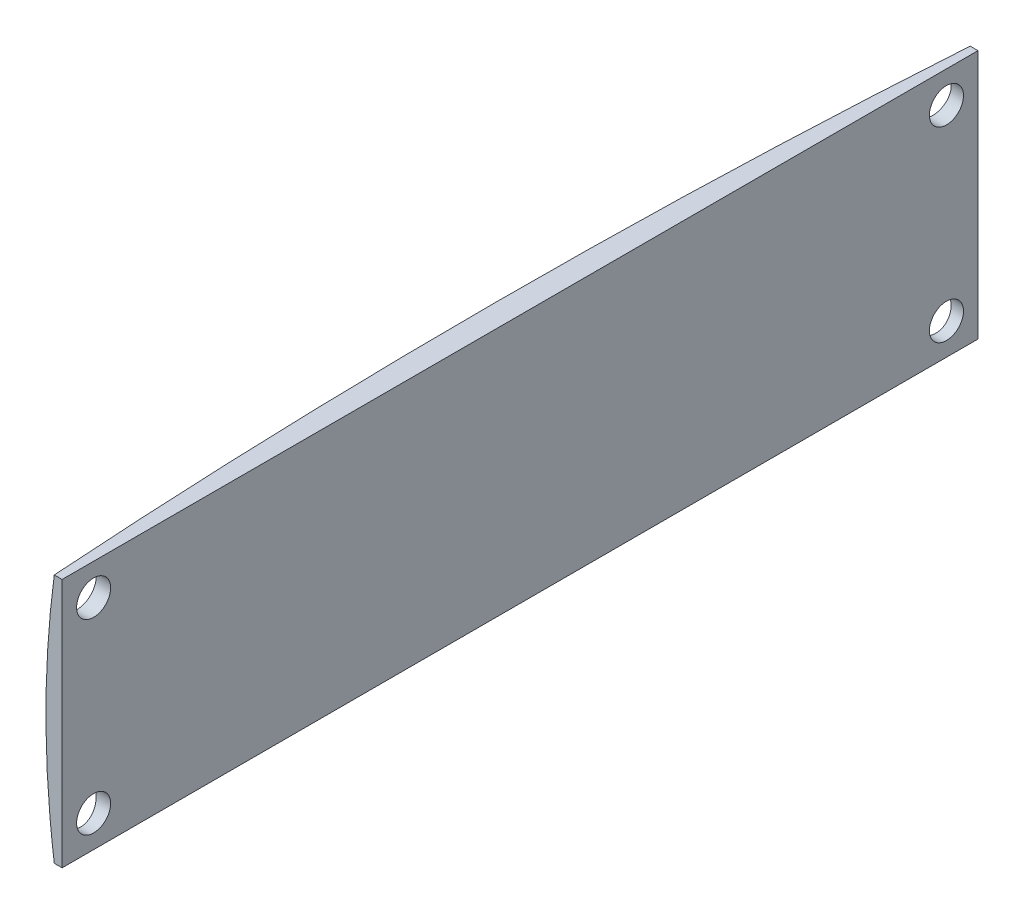
ISO-10303-21;
HEADER;
FILE_DESCRIPTION(('STEP AP214'),'2;1');
FILE_NAME('part.step','',(''),(''),'','','');
FILE_SCHEMA(('AUTOMOTIVE_DESIGN { 1 0 10303 214 1 1 1 1 }'));
ENDSEC;
DATA;
#1=APPLICATION_CONTEXT('core data for automotive mechanical design processes');
#2=APPLICATION_PROTOCOL_DEFINITION('international standard','automotive_design',2000,#1);
#3=PRODUCT_CONTEXT('',#1,'mechanical');
#4=PRODUCT('Part','Part','',(#3));
#5=PRODUCT_RELATED_PRODUCT_CATEGORY('part','',(#4));
#6=PRODUCT_DEFINITION_FORMATION('','',#4);
#7=PRODUCT_DEFINITION_CONTEXT('part definition',#1,'design');
#8=PRODUCT_DEFINITION('design','',#6,#7);
#9=PRODUCT_DEFINITION_SHAPE('','',#8);
#10=(LENGTH_UNIT() NAMED_UNIT(*) SI_UNIT(.MILLI.,.METRE.));
#11=(NAMED_UNIT(*) PLANE_ANGLE_UNIT() SI_UNIT($,.RADIAN.));
#12=(NAMED_UNIT(*) SI_UNIT($,.STERADIAN.) SOLID_ANGLE_UNIT());
#13=UNCERTAINTY_MEASURE_WITH_UNIT(LENGTH_MEASURE(1.E-05),#10,'distance_accuracy_value','');
#14=(GEOMETRIC_REPRESENTATION_CONTEXT(3) GLOBAL_UNCERTAINTY_ASSIGNED_CONTEXT((#13)) GLOBAL_UNIT_ASSIGNED_CONTEXT((#10,
#11,#12)) REPRESENTATION_CONTEXT('',''));
#15=CARTESIAN_POINT('',(0.,0.,0.));
#16=DIRECTION('',(0.,0.,1.));
#17=DIRECTION('',(1.,0.,0.));
#18=AXIS2_PLACEMENT_3D('',#15,#16,#17);
#19=CARTESIAN_POINT('',(-1.2E-05,25.146,0.));
#20=DIRECTION('',(0.,1.,0.));
#21=DIRECTION('',(0.,0.,1.));
#22=AXIS2_PLACEMENT_3D('',#19,#20,#21);
#23=PLANE('',#22);
#24=DIRECTION('',(0.,0.,1.));
#25=VECTOR('',#24,1.);
#26=CARTESIAN_POINT('',(6.35,25.146,-92.2020000000001));
#27=LINE('',#26,#25);
#28=CARTESIAN_POINT('',(6.35,25.146,-92.2020000000001));
#29=VERTEX_POINT('',#28);
#30=CARTESIAN_POINT('',(6.35,25.146,92.2020000000001));
#31=VERTEX_POINT('',#30);
#32=EDGE_CURVE('E103',#29,#31,#27,.T.);
#33=ORIENTED_EDGE('',*,*,#32,.F.);
#34=DIRECTION('',(1.,0.,0.));
#35=VECTOR('',#34,1.);
#36=CARTESIAN_POINT('',(-1.2E-05,25.146,-92.2019999999999));
#37=LINE('',#36,#35);
#38=CARTESIAN_POINT('',(4.7780184712767,25.146,-92.2019999999999));
#39=VERTEX_POINT('',#38);
#40=EDGE_CURVE('E147',#39,#29,#37,.T.);
#41=ORIENTED_EDGE('',*,*,#40,.F.);
#42=CARTESIAN_POINT('',(1372.87,25.1460000000003,0.));
#43=DIRECTION('',(0.,-1.,0.));
#44=DIRECTION('',(1.,0.,0.));
#45=AXIS2_PLACEMENT_3D('',#42,#43,#44);
#46=CIRCLE('',#45,1371.19541959824);
#47=CARTESIAN_POINT('',(4.77801847127677,25.146,92.2020000000002));
#48=VERTEX_POINT('',#47);
#49=EDGE_CURVE('E13',#39,#48,#46,.F.);
#50=ORIENTED_EDGE('',*,*,#49,.T.);
#51=DIRECTION('',(1.,0.,0.));
#52=VECTOR('',#51,1.);
#53=CARTESIAN_POINT('',(-1.2E-05,25.146,92.2020000000001));
#54=LINE('',#53,#52);
#55=EDGE_CURVE('E110',#48,#31,#54,.T.);
#56=ORIENTED_EDGE('',*,*,#55,.T.);
#57=EDGE_LOOP('',(#33,#41,#50,#56));
#58=FACE_BOUND('',#57,.T.);
#59=ADVANCED_FACE('F86',(#58),#23,.T.);
#60=CARTESIAN_POINT('',(-1.2E-05,0.,-92.2019999999999));
#61=DIRECTION('',(0.,0.,1.));
#62=DIRECTION('',(1.,0.,0.));
#63=AXIS2_PLACEMENT_3D('',#60,#61,#62);
#64=PLANE('',#63);
#65=ORIENTED_EDGE('',*,*,#40,.T.);
#66=DIRECTION('',(0.,1.,0.));
#67=VECTOR('',#66,1.);
#68=CARTESIAN_POINT('',(6.35,25.146,-92.2020000000001));
#69=LINE('',#68,#67);
#70=CARTESIAN_POINT('',(6.35,-25.146,-92.2020000000001));
#71=VERTEX_POINT('',#70);
#72=EDGE_CURVE('E141',#71,#29,#69,.T.);
#73=ORIENTED_EDGE('',*,*,#72,.F.);
#74=DIRECTION('',(1.,0.,0.));
#75=VECTOR('',#74,1.);
#76=CARTESIAN_POINT('',(-1.2E-05,-25.146,-92.2019999999999));
#77=LINE('',#76,#75);
#78=CARTESIAN_POINT('',(4.77801847127712,-25.1459999999997,-92.2019999999999));
#79=VERTEX_POINT('',#78);
#80=EDGE_CURVE('E140',#79,#71,#77,.T.);
#81=ORIENTED_EDGE('',*,*,#80,.F.);
#82=CARTESIAN_POINT('',(4.7780184712767,25.146,-92.2019999999999));
#83=CARTESIAN_POINT('',(4.59166788954076,23.7509410775317,-92.2019999999999));
#84=CARTESIAN_POINT('',(4.42060734687266,22.3538353400213,-92.2019999999999));
#85=CARTESIAN_POINT('',(4.10970318609753,19.5596122735176,-92.2019999999999));
#86=CARTESIAN_POINT('',(3.96978429647137,18.162503317759,-92.2019999999999));
#87=CARTESIAN_POINT('',(3.72113135185098,15.368275175018,-92.2019999999999));
#88=CARTESIAN_POINT('',(3.61233662996028,13.9711613899426,-92.2019999999999));
#89=CARTESIAN_POINT('',(3.42589241107428,11.1769289071129,-92.2019999999999));
#90=CARTESIAN_POINT('',(3.34819715871109,9.77981326328065,-92.2019999999999));
#91=CARTESIAN_POINT('',(3.22392182470786,6.98557999081025,-92.2019999999999));
#92=CARTESIAN_POINT('',(3.17731110585369,5.58846372535655,-92.2019999999999));
#93=CARTESIAN_POINT('',(3.11517989386899,2.79423141199115,-92.2019999999999));
#94=CARTESIAN_POINT('',(3.09964402933586,1.39711570599561,-92.2019999999999));
#95=CARTESIAN_POINT('',(3.09964402933586,-1.39711570599546,-92.2019999999999));
#96=CARTESIAN_POINT('',(3.11517989386898,-2.794231411991,-92.2019999999999));
#97=CARTESIAN_POINT('',(3.17731110585369,-5.5884637253564,-92.2019999999999));
#98=CARTESIAN_POINT('',(3.22392182470787,-6.9855799908101,-92.2019999999999));
#99=CARTESIAN_POINT('',(3.34819715871109,-9.7798132632805,-92.2019999999999));
#100=CARTESIAN_POINT('',(3.42589241107429,-11.1769289071127,-92.2019999999999));
#101=CARTESIAN_POINT('',(3.61233662996028,-13.9711613899424,-92.2019999999999));
#102=CARTESIAN_POINT('',(3.72113135185099,-15.3682751750178,-92.2019999999999));
#103=CARTESIAN_POINT('',(3.96978429647138,-18.1625033177588,-92.2019999999999));
#104=CARTESIAN_POINT('',(4.10970318609755,-19.5596122735174,-92.2019999999999));
#105=CARTESIAN_POINT('',(4.42060734687267,-22.3538353400211,-92.2019999999999));
#106=CARTESIAN_POINT('',(4.59166788954076,-23.7509410775315,-92.2019999999999));
#107=CARTESIAN_POINT('',(4.77801847127669,-25.1459999999999,-92.2019999999999));
#108=B_SPLINE_CURVE_WITH_KNOTS('',3,(#82,#83,#84,#85,#86,#87,#88,#89,#90,#91,#92,#93,#94,#95,
#96,#97,#98,#99,#100,#101,#102,#103,#104,#105,#106,#107),.UNSPECIFIED.,.F.,.F.,(4,2,2,2,2,2,2,2,
2,2,2,2,4),(0.,4.22227231704978,8.43422552238614,12.6379120074765,16.8353908464465,
21.0287264716252,25.2199873193706,29.411248167116,33.6045837922947,37.8020626312646,
42.005749116355,46.2177023216914,50.4399746387412),.UNSPECIFIED.);
#109=EDGE_CURVE('E96',#39,#79,#108,.T.);
#110=ORIENTED_EDGE('',*,*,#109,.F.);
#111=EDGE_LOOP('',(#65,#73,#81,#110));
#112=FACE_BOUND('',#111,.T.);
#113=ADVANCED_FACE('F165',(#112),#64,.F.);
#114=CARTESIAN_POINT('',(-1.2E-05,-25.146,0.));
#115=DIRECTION('',(0.,1.,0.));
#116=DIRECTION('',(0.,0.,1.));
#117=AXIS2_PLACEMENT_3D('',#114,#115,#116);
#118=PLANE('',#117);
#119=ORIENTED_EDGE('',*,*,#80,.T.);
#120=DIRECTION('',(0.,0.,-1.));
#121=VECTOR('',#120,1.);
#122=CARTESIAN_POINT('',(6.35,-25.146,-92.2020000000001));
#123=LINE('',#122,#121);
#124=CARTESIAN_POINT('',(6.35,-25.146,92.2020000000001));
#125=VERTEX_POINT('',#124);
#126=EDGE_CURVE('E128',#125,#71,#123,.T.);
#127=ORIENTED_EDGE('',*,*,#126,.F.);
#128=DIRECTION('',(1.,0.,0.));
#129=VECTOR('',#128,1.);
#130=CARTESIAN_POINT('',(-1.2E-05,-25.146,92.2020000000001));
#131=LINE('',#130,#129);
#132=CARTESIAN_POINT('',(4.77801847127669,-25.146,92.2020000000001));
#133=VERTEX_POINT('',#132);
#134=EDGE_CURVE('E137',#133,#125,#131,.T.);
#135=ORIENTED_EDGE('',*,*,#134,.F.);
#136=CARTESIAN_POINT('',(1372.87,-25.1459999999997,0.));
#137=DIRECTION('',(0.,-1.,0.));
#138=DIRECTION('',(1.,0.,0.));
#139=AXIS2_PLACEMENT_3D('',#136,#137,#138);
#140=CIRCLE('',#139,1371.19541959824);
#141=EDGE_CURVE('E159',#79,#133,#140,.F.);
#142=ORIENTED_EDGE('',*,*,#141,.F.);
#143=EDGE_LOOP('',(#119,#127,#135,#142));
#144=FACE_BOUND('',#143,.T.);
#145=ADVANCED_FACE('F136',(#144),#118,.F.);
#146=CARTESIAN_POINT('',(-1.2E-05,0.,92.2020000000001));
#147=DIRECTION('',(0.,0.,1.));
#148=DIRECTION('',(1.,0.,0.));
#149=AXIS2_PLACEMENT_3D('',#146,#147,#148);
#150=PLANE('',#149);
#151=DIRECTION('',(0.,-1.,0.));
#152=VECTOR('',#151,1.);
#153=CARTESIAN_POINT('',(6.35,25.146,92.2020000000001));
#154=LINE('',#153,#152);
#155=EDGE_CURVE('E125',#31,#125,#154,.T.);
#156=ORIENTED_EDGE('',*,*,#155,.F.);
#157=ORIENTED_EDGE('',*,*,#55,.F.);
#158=CARTESIAN_POINT('',(4.77801847127677,25.146,92.2020000000002));
#159=CARTESIAN_POINT('',(4.59166788954078,23.7509410775316,92.2020000000001));
#160=CARTESIAN_POINT('',(4.42060734687266,22.3538353400213,92.2020000000001));
#161=CARTESIAN_POINT('',(4.10970318609752,19.5596122735176,92.202));
#162=CARTESIAN_POINT('',(3.96978429647136,18.162503317759,92.2020000000001));
#163=CARTESIAN_POINT('',(3.72113135185098,15.368275175018,92.2020000000001));
#164=CARTESIAN_POINT('',(3.61233662996028,13.9711613899426,92.2020000000001));
#165=CARTESIAN_POINT('',(3.42589241107428,11.1769289071129,92.2020000000001));
#166=CARTESIAN_POINT('',(3.34819715871108,9.77981326328064,92.2020000000001));
#167=CARTESIAN_POINT('',(3.22392182470786,6.98557999081025,92.2020000000001));
#168=CARTESIAN_POINT('',(3.17731110585369,5.58846372535655,92.2020000000001));
#169=CARTESIAN_POINT('',(3.11517989386899,2.79423141199114,92.2020000000001));
#170=CARTESIAN_POINT('',(3.09964402933586,1.3971157059956,92.2020000000001));
#171=CARTESIAN_POINT('',(3.09964402933586,-1.39711570599547,92.2020000000001));
#172=CARTESIAN_POINT('',(3.11517989386898,-2.79423141199101,92.2020000000001));
#173=CARTESIAN_POINT('',(3.17731110585368,-5.58846372535641,92.2020000000001));
#174=CARTESIAN_POINT('',(3.22392182470786,-6.98557999081011,92.2020000000001));
#175=CARTESIAN_POINT('',(3.34819715871109,-9.77981326328051,92.2020000000001));
#176=CARTESIAN_POINT('',(3.42589241107429,-11.1769289071128,92.2020000000001));
#177=CARTESIAN_POINT('',(3.61233662996026,-13.9711613899424,92.2020000000001));
#178=CARTESIAN_POINT('',(3.72113135185093,-15.3682751750178,92.2020000000001));
#179=CARTESIAN_POINT('',(3.96978429647142,-18.1625033177588,92.202));
#180=CARTESIAN_POINT('',(4.1097031860977,-19.5596122735174,92.202));
#181=CARTESIAN_POINT('',(4.42060734687293,-22.3538353400211,92.2020000000001));
#182=CARTESIAN_POINT('',(4.591667889541,-23.7509410775315,92.2020000000002));
#183=CARTESIAN_POINT('',(4.77801847127669,-25.1459999999999,92.2020000000004));
#184=B_SPLINE_CURVE_WITH_KNOTS('',3,(#158,#159,#160,#161,#162,#163,#164,#165,#166,#167,#168,
#169,#170,#171,#172,#173,#174,#175,#176,#177,#178,#179,#180,#181,#182,#183),.UNSPECIFIED.,.F.,
.F.,(4,2,2,2,2,2,2,2,2,2,2,2,4),(0.,4.22227231704978,8.43422552238614,12.6379120074765,
16.8353908464465,21.0287264716252,25.2199873193706,29.411248167116,33.6045837922947,
37.8020626312646,42.005749116355,46.2177023216914,50.4399746387411),.UNSPECIFIED.);
#185=EDGE_CURVE('E145',#48,#133,#184,.T.);
#186=ORIENTED_EDGE('',*,*,#185,.T.);
#187=ORIENTED_EDGE('',*,*,#134,.T.);
#188=EDGE_LOOP('',(#156,#157,#186,#187));
#189=FACE_BOUND('',#188,.T.);
#190=ADVANCED_FACE('F143',(#189),#150,.T.);
#191=CARTESIAN_POINT('',(1372.87,4.16333634234434E-13,0.));
#192=DIRECTION('',(0.,0.,1.));
#193=DIRECTION('',(-1.,0.,0.));
#194=AXIS2_PLACEMENT_3D('',#191,#192,#193);
#195=ELLIPSE('',#194,1372.87,509.27);
#196=TRIMMED_CURVE('',#195,(PARAMETER_VALUE(4.71238898038469)),
(PARAMETER_VALUE(7.85398163397448)),.T.,.PARAMETER.);
#197=CARTESIAN_POINT('',(1372.87,-509.27,0.));
#198=DIRECTION('',(0.,-1.,0.));
#199=AXIS1_PLACEMENT('',#197,#198);
#200=SURFACE_OF_REVOLUTION('',#196,#199);
#201=CARTESIAN_POINT('',(3.84350644112893,18.7959999999999,-89.2810000000001));
#202=CARTESIAN_POINT('',(3.86271226181631,18.9884953562008,-89.2809917692394));
#203=CARTESIAN_POINT('',(3.88117712961673,19.1812007655573,-89.2647381844845));
#204=CARTESIAN_POINT('',(3.91606436157229,19.5614828574912,-89.2000377571739));
#205=CARTESIAN_POINT('',(3.93248436016621,19.7490534078564,-89.1515540332081));
#206=CARTESIAN_POINT('',(3.96272663881641,20.1135393933856,-89.0236570079777));
#207=CARTESIAN_POINT('',(3.97654945525488,20.2904570235003,-88.9442501035443));
#208=CARTESIAN_POINT('',(4.00109467569637,20.6285203824212,-88.7566978986505));
#209=CARTESIAN_POINT('',(4.01181787153147,20.7896701323344,-88.6485599514212));
#210=CARTESIAN_POINT('',(4.02968899466966,21.0908736554655,-88.4071273516107));
#211=CARTESIAN_POINT('',(4.03685319598981,21.2310213687271,-88.2739511194651));
#212=CARTESIAN_POINT('',(4.04733798657052,21.4870462489509,-87.9858797354929));
#213=CARTESIAN_POINT('',(4.05065856689832,21.6029233595063,-87.8309845331911));
#214=CARTESIAN_POINT('',(4.05322477785549,21.8064588304012,-87.5048510423473));
#215=CARTESIAN_POINT('',(4.0524935431695,21.8942743750866,-87.3337110108302));
#216=CARTESIAN_POINT('',(4.04692845111743,22.0400887403866,-86.9792340080502));
#217=CARTESIAN_POINT('',(4.04209467802054,22.0980881734071,-86.7958972873876));
#218=CARTESIAN_POINT('',(4.02840815143735,22.1825942953944,-86.4225963382514));
#219=CARTESIAN_POINT('',(4.01956254426626,22.2091566810591,-86.2326444465331));
#220=CARTESIAN_POINT('',(3.99808140125354,22.2303168275449,-85.8511851850296));
#221=CARTESIAN_POINT('',(3.9854458213927,22.2249142170901,-85.6596777972031));
#222=CARTESIAN_POINT('',(3.95670626649934,22.1823347104155,-85.2797657491229));
#223=CARTESIAN_POINT('',(3.94058944175397,22.1450385398228,-85.0913754453234));
#224=CARTESIAN_POINT('',(3.90542921791826,22.0396912932162,-84.7236890478606));
#225=CARTESIAN_POINT('',(3.88638569905393,21.971638958295,-84.5443933267898));
#226=CARTESIAN_POINT('',(3.84583667598,21.8061404052524,-84.1984751516541));
#227=CARTESIAN_POINT('',(3.8243130330572,21.7084678267783,-84.0319631285569));
#228=CARTESIAN_POINT('',(3.77964680442421,21.4867483206123,-83.7177818460265));
#229=CARTESIAN_POINT('',(3.75650414427699,21.3627001797241,-83.5701134538436));
#230=CARTESIAN_POINT('',(3.70918639373177,21.0906628747471,-83.2966026499946));
#231=CARTESIAN_POINT('',(3.68500462370725,20.9424933797286,-83.1709407137476));
#232=CARTESIAN_POINT('',(3.63658993388746,20.627099619695,-82.9463860426252));
#233=CARTESIAN_POINT('',(3.6123570127067,20.459874831868,-82.8474940424766));
#234=CARTESIAN_POINT('',(3.56455193025834,20.1104423244286,-82.6789828804153));
#235=CARTESIAN_POINT('',(3.54098239950801,19.9281838640467,-82.609468142319));
#236=CARTESIAN_POINT('',(3.49535417369743,19.5543526041684,-82.5022609392212));
#237=CARTESIAN_POINT('',(3.47329546769284,19.3627798721613,-82.4645682436799));
#238=CARTESIAN_POINT('',(3.43143039621584,18.9762813317629,-82.422242906247));
#239=CARTESIAN_POINT('',(3.41161831224801,18.7813655598614,-82.417524385795));
#240=CARTESIAN_POINT('',(3.37476488888688,18.3932862539023,-82.4411863952071));
#241=CARTESIAN_POINT('',(3.35772345073321,18.2001226576199,-82.4695657449943));
#242=CARTESIAN_POINT('',(3.32698447695801,17.8224662239907,-82.5584238793958));
#243=CARTESIAN_POINT('',(3.31326463506714,17.6379226686421,-82.6186793597014));
#244=CARTESIAN_POINT('',(3.28934711598082,17.2814389000656,-82.7695334513615));
#245=CARTESIAN_POINT('',(3.27914929055905,17.1094981566802,-82.8601307854437));
#246=CARTESIAN_POINT('',(3.26253337742514,16.7844233305733,-83.0683708589751));
#247=CARTESIAN_POINT('',(3.25608841229946,16.6311618907607,-83.1858126764858));
#248=CARTESIAN_POINT('',(3.24693101182293,16.3464303852241,-83.444785569593));
#249=CARTESIAN_POINT('',(3.24421847566907,16.214959731073,-83.586315994504));
#250=CARTESIAN_POINT('',(3.24248163798573,15.9780923177249,-83.8887922300999));
#251=CARTESIAN_POINT('',(3.24344201246442,15.8725891763333,-84.04965466689));
#252=CARTESIAN_POINT('',(3.24887157907232,15.6899359124945,-84.38668618694));
#253=CARTESIAN_POINT('',(3.25334075101971,15.6127856269717,-84.5628551821547));
#254=CARTESIAN_POINT('',(3.26556439458236,15.4889805965208,-84.9255118322421));
#255=CARTESIAN_POINT('',(3.27331922850989,15.4423292161719,-85.1120006231135));
#256=CARTESIAN_POINT('',(3.29182939752899,15.3807888892312,-85.4900003310377));
#257=CARTESIAN_POINT('',(3.30258478114085,15.3659004562949,-85.6815113292564));
#258=CARTESIAN_POINT('',(3.32680996729525,15.3682302838467,-86.0648403419749));
#259=CARTESIAN_POINT('',(3.34028918242755,15.385561635709,-86.2566570677842));
#260=CARTESIAN_POINT('',(3.36957484618389,15.4519764433982,-86.6345279048942));
#261=CARTESIAN_POINT('',(3.38538135809466,15.5010607628142,-86.8205818593197));
#262=CARTESIAN_POINT('',(3.41902213017551,15.6298528131588,-87.182663056399));
#263=CARTESIAN_POINT('',(3.43686640461504,15.7097168009231,-87.3586337870988));
#264=CARTESIAN_POINT('',(3.47410517672298,15.8977199355029,-87.6945700801279));
#265=CARTESIAN_POINT('',(3.49349965590655,16.0058587452009,-87.8545358332513));
#266=CARTESIAN_POINT('',(3.5335081216539,16.2479050246736,-88.154739863754));
#267=CARTESIAN_POINT('',(3.55412756767905,16.3819349540939,-88.2948786782689));
#268=CARTESIAN_POINT('',(3.59605156168066,16.6716385945936,-88.5506045071951));
#269=CARTESIAN_POINT('',(3.61735629094633,16.8273180697893,-88.666184962243));
#270=CARTESIAN_POINT('',(3.6602485278621,17.15649305055,-88.8698933702761));
#271=CARTESIAN_POINT('',(3.6818368068416,17.3300546199136,-88.9579142937149));
#272=CARTESIAN_POINT('',(3.72469247595366,17.6894413819755,-89.1033168113762));
#273=CARTESIAN_POINT('',(3.74596021348956,17.8752519175878,-89.1607343037916));
#274=CARTESIAN_POINT('',(3.78001343571083,18.1845078176723,-89.2282772513338));
#275=CARTESIAN_POINT('',(3.79305648960988,18.305909248685,-89.2480186790095));
#276=CARTESIAN_POINT('',(3.81866927512186,18.550178552509,-89.2743826904942));
#277=CARTESIAN_POINT('',(3.83123900612049,18.6730464272233,-89.2810052572772));
#278=CARTESIAN_POINT('',(3.84350644112893,18.7959999999999,-89.2810000000001));
#279=B_SPLINE_CURVE_WITH_KNOTS('',3,(#201,#202,#203,#204,#205,#206,#207,#208,#209,#210,#211,
#212,#213,#214,#215,#216,#217,#218,#219,#220,#221,#222,#223,#224,#225,#226,#227,#228,#229,#230,
#231,#232,#233,#234,#235,#236,#237,#238,#239,#240,#241,#242,#243,#244,#245,#246,#247,#248,#249,
#250,#251,#252,#253,#254,#255,#256,#257,#258,#259,#260,#261,#262,#263,#264,#265,#266,#267,#268,
#269,#270,#271,#272,#273,#274,#275,#276,#277,#278),.UNSPECIFIED.,.T.,.F.,(4,2,2,2,2,2,2,2,2,2,2,
2,2,2,2,2,2,2,2,2,2,2,2,2,2,2,2,2,2,2,2,2,2,2,2,2,2,2,4),(0.,0.579905766158203,1.16047627173083,
1.74092674306254,2.3212288006419,2.8988523405832,3.47647722294945,4.05080744620893,
4.62512587258444,5.19842525434185,5.77173129502812,6.34719078833844,6.92267383841597,
7.50267060940894,8.08269406427645,8.66727170686142,9.25186539212051,9.83851993137081,
10.4251702204774,11.0102920552279,11.5953930285854,12.176448394352,12.7574793030519,
13.3342960837084,13.9110972857663,14.4854946081518,15.0598886267569,15.6343460006887,
16.2088126644032,16.7852995128999,17.3618020408357,17.9412706493124,18.5207323491652,
19.1030050322521,19.6854330412867,20.2700956756319,20.8540709758655,21.2244767596415,
21.5948830241362),.UNSPECIFIED.);
#280=CARTESIAN_POINT('',(3.84350644112893,18.7959999999999,-89.2810000000001));
#281=VERTEX_POINT('',#280);
#282=EDGE_CURVE('E131',#281,#281,#279,.T.);
#283=ORIENTED_EDGE('',*,*,#282,.T.);
#284=EDGE_LOOP('',(#283));
#285=FACE_BOUND('',#284,.T.);
#286=CARTESIAN_POINT('',(3.84350644112894,-18.7960000000001,-89.2810000000001));
#287=CARTESIAN_POINT('',(3.82416979745418,-18.6021967518642,-89.2809913131429));
#288=CARTESIAN_POINT('',(3.80405403535252,-18.408325517274,-89.2645149146861));
#289=CARTESIAN_POINT('',(3.76282676595103,-18.0260814130698,-89.1990814083742));
#290=CARTESIAN_POINT('',(3.74171403802477,-17.837715766031,-89.1500834722642));
#291=CARTESIAN_POINT('',(3.69905601555515,-17.4720901472664,-89.021045271072));
#292=CARTESIAN_POINT('',(3.67751097428364,-17.294823910099,-88.9410227057759));
#293=CARTESIAN_POINT('',(3.63449777940847,-16.956377174898,-88.7522365646787));
#294=CARTESIAN_POINT('',(3.61302960735217,-16.7951925264427,-88.6434804311602));
#295=CARTESIAN_POINT('',(3.57062681355467,-16.4932591267592,-88.4001483641188));
#296=CARTESIAN_POINT('',(3.54969284158904,-16.3525343683172,-88.2655425396562));
#297=CARTESIAN_POINT('',(3.50884976266647,-16.0957840424969,-87.9743921720791));
#298=CARTESIAN_POINT('',(3.48894069579336,-15.9797594405814,-87.8178467718022));
#299=CARTESIAN_POINT('',(3.45062417577412,-15.7759495494466,-87.4875239872384));
#300=CARTESIAN_POINT('',(3.43221436988144,-15.6881193524145,-87.3137745888402));
#301=CARTESIAN_POINT('',(3.3972855095271,-15.5430310464798,-86.9537691209872));
#302=CARTESIAN_POINT('',(3.380766417403,-15.4857723285193,-86.7675133007737));
#303=CARTESIAN_POINT('',(3.35008592376041,-15.4037203795928,-86.3885750550185));
#304=CARTESIAN_POINT('',(3.33591540430273,-15.3787989005092,-86.1959211435209));
#305=CARTESIAN_POINT('',(3.31023180340657,-15.3618059998273,-85.8089927785232));
#306=CARTESIAN_POINT('',(3.29871864489868,-15.3697336254051,-85.6147183721903));
#307=CARTESIAN_POINT('',(3.27875079386526,-15.418167435771,-85.2311425755838));
#308=CARTESIAN_POINT('',(3.2702805079979,-15.4585039906361,-85.0418205781691));
#309=CARTESIAN_POINT('',(3.25661671873342,-15.5704563910622,-84.6725375020955));
#310=CARTESIAN_POINT('',(3.25142312268059,-15.6420713520596,-84.4925761588752));
#311=CARTESIAN_POINT('',(3.24457219734608,-15.8141463857437,-84.1480366813344));
#312=CARTESIAN_POINT('',(3.24289786438313,-15.9144650873139,-83.983388269586));
#313=CARTESIAN_POINT('',(3.24319794834599,-16.1412337785769,-83.6732009837098));
#314=CARTESIAN_POINT('',(3.24517228839113,-16.2676832176227,-83.5276617070053));
#315=CARTESIAN_POINT('',(3.25282782939993,-16.5427290946912,-83.2601829428099));
#316=CARTESIAN_POINT('',(3.25849940006001,-16.6912672238215,-83.1381832080403));
#317=CARTESIAN_POINT('',(3.27349730518516,-17.0064809541096,-82.9207333783765));
#318=CARTESIAN_POINT('',(3.28282363772124,-17.1731565456944,-82.8252832694694));
#319=CARTESIAN_POINT('',(3.30498094945711,-17.520107410769,-82.6634537908069));
#320=CARTESIAN_POINT('',(3.31781635581612,-17.7003996540926,-82.5971114215833));
#321=CARTESIAN_POINT('',(3.34669520407488,-18.0692768236335,-82.4954363188668));
#322=CARTESIAN_POINT('',(3.36273872283217,-18.257861948441,-82.4601043284065));
#323=CARTESIAN_POINT('',(3.39771307070351,-18.6390490256929,-82.4212117203763));
#324=CARTESIAN_POINT('',(3.41665898034066,-18.8316671383574,-82.4178231876746));
#325=CARTESIAN_POINT('',(3.45683769175307,-19.2145254434208,-82.4432335056031));
#326=CARTESIAN_POINT('',(3.47807058775928,-19.404765537477,-82.4720336829673));
#327=CARTESIAN_POINT('',(3.52235548402294,-19.7790018187904,-82.5612510064372));
#328=CARTESIAN_POINT('',(3.54542001433735,-19.9629399829813,-82.6219053469163));
#329=CARTESIAN_POINT('',(3.59249956045478,-20.3179142601414,-82.7731940468349));
#330=CARTESIAN_POINT('',(3.61651461325151,-20.4889498701972,-82.8638295741347));
#331=CARTESIAN_POINT('',(3.66486142805937,-20.8143310435793,-83.0731469919832));
#332=CARTESIAN_POINT('',(3.68919422533105,-20.9685706029349,-83.1919934754542));
#333=CARTESIAN_POINT('',(3.73721964680474,-21.2548116375953,-83.454095637418));
#334=CARTESIAN_POINT('',(3.76091226174127,-21.3868127911837,-83.5973516689764));
#335=CARTESIAN_POINT('',(3.80687266779825,-21.624895441691,-83.9043957570261));
#336=CARTESIAN_POINT('',(3.8291392242454,-21.7309546963475,-84.0682012516168));
#337=CARTESIAN_POINT('',(3.87146256297029,-21.9138897248772,-84.4116339863735));
#338=CARTESIAN_POINT('',(3.89151939736879,-21.9907661871903,-84.5912608531805));
#339=CARTESIAN_POINT('',(3.92864334798174,-22.1126876211141,-84.9602674717372));
#340=CARTESIAN_POINT('',(3.94572536976943,-22.1578949374637,-85.1495920631484));
#341=CARTESIAN_POINT('',(3.97646100435481,-22.215680745214,-85.5334303364292));
#342=CARTESIAN_POINT('',(3.99011477243594,-22.2282607147179,-85.7279437828268));
#343=CARTESIAN_POINT('',(4.01346780013085,-22.2203340254297,-86.1148913839218));
#344=CARTESIAN_POINT('',(4.02319932942697,-22.2001045410049,-86.3073292749409));
#345=CARTESIAN_POINT('',(4.03860608122912,-22.127562327081,-86.686227176914));
#346=CARTESIAN_POINT('',(4.04428147050958,-22.0752509168439,-86.8726874333464));
#347=CARTESIAN_POINT('',(4.05144731267281,-21.9404669947227,-87.2329815545217));
#348=CARTESIAN_POINT('',(4.0529663582659,-21.8582049861288,-87.4068936318116));
#349=CARTESIAN_POINT('',(4.05195481242686,-21.665810151487,-87.7385247396477));
#350=CARTESIAN_POINT('',(4.04942445194082,-21.555678915181,-87.8962446931185));
#351=CARTESIAN_POINT('',(4.0405186548523,-21.3109549947946,-88.1907224815361));
#352=CARTESIAN_POINT('',(4.03415107947915,-21.1764127139631,-88.3275224583772));
#353=CARTESIAN_POINT('',(4.0178883044561,-20.8865167193227,-88.5767615725779));
#354=CARTESIAN_POINT('',(4.00799218313595,-20.7311575746907,-88.689194332775));
#355=CARTESIAN_POINT('',(3.98503779767561,-20.4034651892062,-88.8869422981466));
#356=CARTESIAN_POINT('',(3.97196758709106,-20.2310693157188,-88.9721521696573));
#357=CARTESIAN_POINT('',(3.94317136265055,-19.8748139154431,-89.1124869234037));
#358=CARTESIAN_POINT('',(3.9274484677542,-19.6909680096368,-89.1676468192129));
#359=CARTESIAN_POINT('',(3.90021478094734,-19.3876440253995,-89.2316725193735));
#360=CARTESIAN_POINT('',(3.88935278791394,-19.2700493435361,-89.2501526520728));
#361=CARTESIAN_POINT('',(3.86692698978308,-19.0336449634025,-89.2748190685457));
#362=CARTESIAN_POINT('',(3.85536318321527,-18.9148352625871,-89.2810053265617));
#363=CARTESIAN_POINT('',(3.84350644112894,-18.7960000000001,-89.2810000000001));
#364=B_SPLINE_CURVE_WITH_KNOTS('',3,(#286,#287,#288,#289,#290,#291,#292,#293,#294,#295,#296,
#297,#298,#299,#300,#301,#302,#303,#304,#305,#306,#307,#308,#309,#310,#311,#312,#313,#314,#315,
#316,#317,#318,#319,#320,#321,#322,#323,#324,#325,#326,#327,#328,#329,#330,#331,#332,#333,#334,
#335,#336,#337,#338,#339,#340,#341,#342,#343,#344,#345,#346,#347,#348,#349,#350,#351,#352,#353,
#354,#355,#356,#357,#358,#359,#360,#361,#362,#363),.UNSPECIFIED.,.T.,.F.,(4,2,2,2,2,2,2,2,2,2,2,
2,2,2,2,2,2,2,2,2,2,2,2,2,2,2,2,2,2,2,2,2,2,2,2,2,2,2,4),(0.,0.583859197381522,1.16845277439552,
1.75271332595525,2.33682269626621,2.92161160538329,3.50642336812888,4.09029897173662,
4.67416294269702,5.25570418422004,5.83722855762474,6.41572887872768,6.99421284071454,
7.56989531186605,8.14556565303274,8.71974248520838,9.29391901433181,9.8688233126767,
10.4437413857968,11.0217548824091,11.5997922040934,12.1821960792768,12.7646226435712,
13.3505346425141,13.9364551169445,14.5228762051214,15.1092834584081,15.6926621838752,
16.2760144803164,16.8544642338192,17.4328902021043,18.0073268827774,18.5817308032961,
19.1549619350964,19.7283429069699,20.3039163243784,20.8788176540056,21.2368246344548,
21.5948323649858),.UNSPECIFIED.);
#365=CARTESIAN_POINT('',(3.84350644112894,-18.7960000000001,-89.2810000000001));
#366=VERTEX_POINT('',#365);
#367=EDGE_CURVE('E184',#366,#366,#364,.T.);
#368=ORIENTED_EDGE('',*,*,#367,.T.);
#369=EDGE_LOOP('',(#368));
#370=FACE_BOUND('',#369,.T.);
#371=CARTESIAN_POINT('',(3.41350704445606,-18.7960000000001,82.4229999999998));
#372=CARTESIAN_POINT('',(3.39436924449468,-18.604119081168,82.4230081902815));
#373=CARTESIAN_POINT('',(3.37647283640744,-18.4119806937496,82.4391583975194));
#374=CARTESIAN_POINT('',(3.34367398813089,-18.032721251482,82.5034903101904));
#375=CARTESIAN_POINT('',(3.32877489487117,-17.8456060054322,82.5517075672993));
#376=CARTESIAN_POINT('',(3.30236212515313,-17.4819154557681,82.6789392865821));
#377=CARTESIAN_POINT('',(3.29084784954422,-17.3053382912111,82.7579482925061));
#378=CARTESIAN_POINT('',(3.27145073922401,-16.9678515354919,82.944579968504));
#379=CARTESIAN_POINT('',(3.26356701345374,-16.8069381075762,83.0521956073107));
#380=CARTESIAN_POINT('',(3.25156916637721,-16.5060861165859,83.2924638461406));
#381=CARTESIAN_POINT('',(3.24743798055722,-16.3660550481094,83.4249997651269));
#382=CARTESIAN_POINT('',(3.24287821607497,-16.1101166755428,83.7116744257249));
#383=CARTESIAN_POINT('',(3.24244969960849,-15.9942097767116,83.865813530173));
#384=CARTESIAN_POINT('',(3.24518102488363,-15.7901322264324,84.190821271636));
#385=CARTESIAN_POINT('',(3.24833056339875,-15.7018828650054,84.3616405851406));
#386=CARTESIAN_POINT('',(3.25800530284286,-15.5551429541796,84.7155236513587));
#387=CARTESIAN_POINT('',(3.26453050304707,-15.4966523983913,84.8985874014431));
#388=CARTESIAN_POINT('',(3.28070395535928,-15.4109726543096,85.2720190975045));
#389=CARTESIAN_POINT('',(3.29035633501652,-15.3838250527518,85.4623964022603));
#390=CARTESIAN_POINT('',(3.31246718546412,-15.3616612924836,85.8448482887754));
#391=CARTESIAN_POINT('',(3.32492570435777,-15.3666456846254,86.0369228995759));
#392=CARTESIAN_POINT('',(3.35235683562903,-15.4086100932746,86.4181848529888));
#393=CARTESIAN_POINT('',(3.36733983490417,-15.4457250331258,86.607356592118));
#394=CARTESIAN_POINT('',(3.39940306423604,-15.5509983545396,86.9766674521292));
#395=CARTESIAN_POINT('',(3.41648335189289,-15.6191575888449,87.1568063247403));
#396=CARTESIAN_POINT('',(3.45243620798375,-15.784965265031,87.5039387477428));
#397=CARTESIAN_POINT('',(3.4713177116811,-15.8827665853303,87.6708583521395));
#398=CARTESIAN_POINT('',(3.51037331166312,-16.1049055254905,87.9858208545134));
#399=CARTESIAN_POINT('',(3.53054744113028,-16.2292438267629,88.1338632676097));
#400=CARTESIAN_POINT('',(3.57184113580011,-16.5015425166185,88.4075706136945));
#401=CARTESIAN_POINT('',(3.59296462139546,-16.6496088847134,88.5331295316539));
#402=CARTESIAN_POINT('',(3.63560020075704,-16.9647351368877,88.7574988717373));
#403=CARTESIAN_POINT('',(3.65711230185124,-17.1317953794425,88.8563087889028));
#404=CARTESIAN_POINT('',(3.70008804217545,-17.4806424059071,89.0246138482065));
#405=CARTESIAN_POINT('',(3.72155140317321,-17.6624669344756,89.0940308440073));
#406=CARTESIAN_POINT('',(3.76384970917498,-18.0352963196945,89.2011777819392));
#407=CARTESIAN_POINT('',(3.78468465093096,-18.2263012237812,89.2389075603191));
#408=CARTESIAN_POINT('',(3.82517652506733,-18.6120145554397,89.2815522318385));
#409=CARTESIAN_POINT('',(3.84483376312878,-18.8067220045538,89.2864756769748));
#410=CARTESIAN_POINT('',(3.8824183866231,-19.1943354249303,89.2633139794076));
#411=CARTESIAN_POINT('',(3.9003457950794,-19.3872414201387,89.2352292760968));
#412=CARTESIAN_POINT('',(3.93385392945994,-19.7650410227885,89.1469204053276));
#413=CARTESIAN_POINT('',(3.94944272919586,-19.9499605503536,89.0868102355343));
#414=CARTESIAN_POINT('',(3.97781730870516,-20.3071832618522,88.9361431952549));
#415=CARTESIAN_POINT('',(3.99060317730041,-20.479486845456,88.8455872897919));
#416=CARTESIAN_POINT('',(4.01281796319867,-20.8054768614454,88.6371828582815));
#417=CARTESIAN_POINT('',(4.02226673317374,-20.9592696782183,88.5195028656688));
#418=CARTESIAN_POINT('',(4.03750913635277,-21.244982281914,88.2598587821897));
#419=CARTESIAN_POINT('',(4.04330290983706,-21.3769029081577,88.1178956235874));
#420=CARTESIAN_POINT('',(4.05090809279776,-21.6142804070262,87.8146957469961));
#421=CARTESIAN_POINT('',(4.05274429795652,-21.7198983640387,87.6535857461927));
#422=CARTESIAN_POINT('',(4.05233601958529,-21.9027096335515,87.3159817664341));
#423=CARTESIAN_POINT('',(4.05009164701617,-21.9799037188976,87.1394882059199));
#424=CARTESIAN_POINT('',(4.04151020934487,-22.103479307986,86.7767755191631));
#425=CARTESIAN_POINT('',(4.03518669060879,-22.1499617709341,86.5905904518314));
#426=CARTESIAN_POINT('',(4.0185884826606,-22.2112705070118,86.2132542495819));
#427=CARTESIAN_POINT('',(4.00831377505975,-22.2260966328115,86.022103091556));
#428=CARTESIAN_POINT('',(3.98407174010512,-22.2237744798371,85.6398498950725));
#429=CARTESIAN_POINT('',(3.97009705212219,-22.2065620482987,85.4487487231371));
#430=CARTESIAN_POINT('',(3.93889387011699,-22.1406484150268,85.0723330225271));
#431=CARTESIAN_POINT('',(3.9216652616403,-22.0919461055123,84.8870186976682));
#432=CARTESIAN_POINT('',(3.88437960714267,-21.9640944558238,84.5260545565194));
#433=CARTESIAN_POINT('',(3.86430381303016,-21.8847367506997,84.3504804941748));
#434=CARTESIAN_POINT('',(3.82208244768968,-21.6979346704605,84.0152535002833));
#435=CARTESIAN_POINT('',(3.79993685884129,-21.5904900562243,83.8556007042999));
#436=CARTESIAN_POINT('',(3.75412401414667,-21.3495795495937,83.5553446725656));
#437=CARTESIAN_POINT('',(3.73044569749712,-21.2159059939297,83.4149097309676));
#438=CARTESIAN_POINT('',(3.68252289717338,-20.9268604890281,83.1585261267026));
#439=CARTESIAN_POINT('',(3.65827825672448,-20.7714824706403,83.0425843358385));
#440=CARTESIAN_POINT('',(3.60989585481394,-20.4424877683889,82.8378860664344));
#441=CARTESIAN_POINT('',(3.58575950008213,-20.2687717515998,82.7492890397701));
#442=CARTESIAN_POINT('',(3.53854542534951,-19.9088696480864,82.6028118190587));
#443=CARTESIAN_POINT('',(3.51546648778287,-19.7226985434441,82.5448954420733));
#444=CARTESIAN_POINT('',(3.47915655607885,-19.412153359851,82.4765377484962));
#445=CARTESIAN_POINT('',(3.46539120048416,-19.2898716736846,82.4564950767566));
#446=CARTESIAN_POINT('',(3.4387469495815,-19.0437624626048,82.4297235533334));
#447=CARTESIAN_POINT('',(3.42586805482533,-18.9199349367293,82.4229947099374));
#448=CARTESIAN_POINT('',(3.41350704445606,-18.7960000000001,82.4229999999998));
#449=B_SPLINE_CURVE_WITH_KNOTS('',3,(#371,#372,#373,#374,#375,#376,#377,#378,#379,#380,#381,
#382,#383,#384,#385,#386,#387,#388,#389,#390,#391,#392,#393,#394,#395,#396,#397,#398,#399,#400,
#401,#402,#403,#404,#405,#406,#407,#408,#409,#410,#411,#412,#413,#414,#415,#416,#417,#418,#419,
#420,#421,#422,#423,#424,#425,#426,#427,#428,#429,#430,#431,#432,#433,#434,#435,#436,#437,#438,
#439,#440,#441,#442,#443,#444,#445,#446,#447,#448),.UNSPECIFIED.,.T.,.F.,(4,2,2,2,2,2,2,2,2,2,2,
2,2,2,2,2,2,2,2,2,2,2,2,2,2,2,2,2,2,2,2,2,2,2,2,2,2,2,4),(0.,0.578048596796749,1.15673912764821,
1.7353271620332,2.31377311568276,2.88957524715575,3.46538705067622,4.0395449627162,
4.61370275148024,5.1886214770235,5.76355005866543,6.34090466930412,6.9182751400105,
7.49867557600114,8.0790909171977,8.66217484973487,9.24526978876603,9.82990540127515,
10.4145440350094,10.9990302584374,11.5835087014819,12.1659204040164,12.7483136478824,
13.3271813917407,13.9060269170555,14.481235081436,15.0564276047369,15.6297197466272,
16.2030145566377,16.7774585450215,17.3519227428453,17.9303623038489,18.5088067896243,
19.0920306153492,19.6754178537877,20.2621453094476,20.848179264349,21.2215377624882,
21.5948964930304),.UNSPECIFIED.);
#450=CARTESIAN_POINT('',(3.41350704445606,-18.7960000000001,82.4229999999998));
#451=VERTEX_POINT('',#450);
#452=EDGE_CURVE('E211',#451,#451,#449,.T.);
#453=ORIENTED_EDGE('',*,*,#452,.T.);
#454=EDGE_LOOP('',(#453));
#455=FACE_BOUND('',#454,.T.);
#456=CARTESIAN_POINT('',(3.41350704445598,18.7959999999999,82.4229999999998));
#457=CARTESIAN_POINT('',(3.43285143874733,18.9899342123604,82.4230087967951));
#458=CARTESIAN_POINT('',(3.45349216199537,19.1838873183208,82.4395082336336));
#459=CARTESIAN_POINT('',(3.49674173018366,19.5661815490082,82.5049769408206));
#460=CARTESIAN_POINT('',(3.5193530900773,19.7545150782381,82.553988246343));
#461=CARTESIAN_POINT('',(3.56580340147424,20.1199613326186,82.6829826461303));
#462=CARTESIAN_POINT('',(3.58964146683852,20.2970819569938,82.7629436480853));
#463=CARTESIAN_POINT('',(3.63778047835323,20.6352133094126,82.9515161749183));
#464=CARTESIAN_POINT('',(3.66208130510925,20.7962281275471,83.0601204002036));
#465=CARTESIAN_POINT('',(3.71043191536408,21.0982075035725,83.3033541520448));
#466=CARTESIAN_POINT('',(3.73448055235577,21.2391014184506,83.4380716393404));
#467=CARTESIAN_POINT('',(3.78142819592543,21.4961614951994,83.7295189213401));
#468=CARTESIAN_POINT('',(3.8043271502157,21.612326533175,83.8862497159832));
#469=CARTESIAN_POINT('',(3.84816649764753,21.8164265404677,84.2171284476738));
#470=CARTESIAN_POINT('',(3.86910908395881,21.9043933968922,84.3912564171398));
#471=CARTESIAN_POINT('',(3.9083495637611,22.0496452066032,84.7521520871507));
#472=CARTESIAN_POINT('',(3.92664754938525,22.1069312289431,84.9389193470325));
#473=CARTESIAN_POINT('',(3.95987254470378,22.1887626937975,85.3184800011809));
#474=CARTESIAN_POINT('',(3.97482109247493,22.2135226149328,85.5112252519557));
#475=CARTESIAN_POINT('',(4.0010227601296,22.2301556784921,85.898379496841));
#476=CARTESIAN_POINT('',(4.01227606868469,22.2220305002461,86.0927884054882));
#477=CARTESIAN_POINT('',(4.03068051102811,22.1732266927135,86.4759995529114));
#478=CARTESIAN_POINT('',(4.03786549735965,22.1328236590833,86.6648352824224));
#479=CARTESIAN_POINT('',(4.04811624378847,22.0208939982147,87.0331620561294));
#480=CARTESIAN_POINT('',(4.0511821504727,21.9493684786617,87.2126534326473));
#481=CARTESIAN_POINT('',(4.05318565613306,21.7777057161149,87.556151578858));
#482=CARTESIAN_POINT('',(4.05214625731056,21.6777307968693,87.7202393670945));
#483=CARTESIAN_POINT('',(4.04613474331905,21.4518643535477,88.0294007491402));
#484=CARTESIAN_POINT('',(4.04116265892992,21.3259730323168,88.174474491756));
#485=CARTESIAN_POINT('',(4.02755922146101,21.0519003968141,88.4415087656326));
#486=CARTESIAN_POINT('',(4.01892843423861,20.9037225316794,88.5634728668268));
#487=CARTESIAN_POINT('',(3.99838365783053,20.5892860673975,88.7809434218898));
#488=CARTESIAN_POINT('',(3.98646960254214,20.4230271042607,88.8764493429929));
#489=CARTESIAN_POINT('',(3.95974861270303,20.076333586461,89.0387839144876));
#490=CARTESIAN_POINT('',(3.94492864107287,19.8958374241957,89.1054788203406));
#491=CARTESIAN_POINT('',(3.91293811515506,19.5264399908348,89.2077759473513));
#492=CARTESIAN_POINT('',(3.89576748250621,19.3375384396804,89.2433771316824));
#493=CARTESIAN_POINT('',(3.85948922331921,18.955375253387,89.2827109302625));
#494=CARTESIAN_POINT('',(3.84036972226657,18.7620932482263,89.2862347151685));
#495=CARTESIAN_POINT('',(3.80083412892098,18.3778056934989,89.2608470930008));
#496=CARTESIAN_POINT('',(3.78041799635694,18.186800214856,89.2319346780512));
#497=CARTESIAN_POINT('',(3.73871189140024,17.8113927780583,89.1422935263278));
#498=CARTESIAN_POINT('',(3.71741777192803,17.6270323633332,89.0813926814576));
#499=CARTESIAN_POINT('',(3.67458571701746,17.2712251860394,88.9294223316652));
#500=CARTESIAN_POINT('',(3.65304777718975,17.0997786563786,88.8383522827876));
#501=CARTESIAN_POINT('',(3.61017359656277,16.7742292817823,88.6283466743731));
#502=CARTESIAN_POINT('',(3.58883801996067,16.6201723509029,88.5093397887433));
#503=CARTESIAN_POINT('',(3.54690552875706,16.334318384465,88.24695393));
#504=CARTESIAN_POINT('',(3.5263086157204,16.2025213960619,88.1035749052579));
#505=CARTESIAN_POINT('',(3.48632415308032,15.9650641886846,87.7966010048184));
#506=CARTESIAN_POINT('',(3.46693581726233,15.8593868425893,87.6330194823757));
#507=CARTESIAN_POINT('',(3.42979073713918,15.6771389030755,87.2902033361215));
#508=CARTESIAN_POINT('',(3.41203396908498,15.6005678859353,87.1109689402268));
#509=CARTESIAN_POINT('',(3.37862650402734,15.4790110673776,86.7425743900735));
#510=CARTESIAN_POINT('',(3.36296896354281,15.4339205115351,86.5534494281249));
#511=CARTESIAN_POINT('',(3.33408538661235,15.3762919448401,86.1701199482594));
#512=CARTESIAN_POINT('',(3.32085929422311,15.3637531849413,85.9759155473288));
#513=CARTESIAN_POINT('',(3.29726793569863,15.37165777862,85.5889740501649));
#514=CARTESIAN_POINT('',(3.28688877017918,15.3919374272222,85.3962344597715));
#515=CARTESIAN_POINT('',(3.26923574255859,15.4646701550083,85.0167763927825));
#516=CARTESIAN_POINT('',(3.26196179476112,15.5171223462122,84.8300577501552));
#517=CARTESIAN_POINT('',(3.25083061981402,15.6524013343868,84.4689551619675));
#518=CARTESIAN_POINT('',(3.24695606136871,15.7350709759929,84.2945128690216));
#519=CARTESIAN_POINT('',(3.24277420653346,15.9284853544894,83.9619199223765));
#520=CARTESIAN_POINT('',(3.2424666800786,16.0392282802501,83.8037682186257));
#521=CARTESIAN_POINT('',(3.24554250189652,16.2851760144374,83.5088083286132));
#522=CARTESIAN_POINT('',(3.24891255870721,16.4202912680301,83.3719253098793));
#523=CARTESIAN_POINT('',(3.25935196995777,16.7114276721199,83.1226546776576));
#524=CARTESIAN_POINT('',(3.2664222214667,16.8674538854085,83.0102730136012));
#525=CARTESIAN_POINT('',(3.28417620152571,17.1959635877075,82.8131428850581));
#526=CARTESIAN_POINT('',(3.29486148963827,17.3684541565089,82.7284063780098));
#527=CARTESIAN_POINT('',(3.31962620854733,17.7247921579438,82.5890143998085));
#528=CARTESIAN_POINT('',(3.33370158312606,17.9086258245685,82.5343232342487));
#529=CARTESIAN_POINT('',(3.35890748906551,18.2106936144217,82.4712678287702));
#530=CARTESIAN_POINT('',(3.36909925463802,18.3270673813629,82.4531818761102));
#531=CARTESIAN_POINT('',(3.39053767627307,18.5609584539898,82.4290453062485));
#532=CARTESIAN_POINT('',(3.4017843305905,18.6784757577833,82.4229946691369));
#533=CARTESIAN_POINT('',(3.41350704445598,18.7959999999999,82.4229999999998));
#534=B_SPLINE_CURVE_WITH_KNOTS('',3,(#456,#457,#458,#459,#460,#461,#462,#463,#464,#465,#466,
#467,#468,#469,#470,#471,#472,#473,#474,#475,#476,#477,#478,#479,#480,#481,#482,#483,#484,#485,
#486,#487,#488,#489,#490,#491,#492,#493,#494,#495,#496,#497,#498,#499,#500,#501,#502,#503,#504,
#505,#506,#507,#508,#509,#510,#511,#512,#513,#514,#515,#516,#517,#518,#519,#520,#521,#522,#523,
#524,#525,#526,#527,#528,#529,#530,#531,#532,#533),.UNSPECIFIED.,.T.,.F.,(4,2,2,2,2,2,2,2,2,2,2,
2,2,2,2,2,2,2,2,2,2,2,2,2,2,2,2,2,2,2,2,2,2,2,2,2,2,2,4),(0.,0.584255427129484,1.16926772465987,
1.75386320037361,2.33830983836002,2.9247604734665,3.51123775630301,4.09704947914609,
4.68284078843875,5.26474964410858,5.84662878404709,6.42359213392339,7.00053495068407,
7.57424973081791,8.14796002071225,8.72158161254946,9.29521475407156,9.87148288520205,
10.447770231382,11.02780664455,11.6078610814369,12.1910688587767,12.774287152018,
13.3590109845595,13.9437360557615,14.52807668888,15.1124088150046,15.6947871280719,
16.2771520399704,16.8566209394689,17.4360738460247,18.0125550353425,18.5889990428141,
19.1633665549964,19.7378733804355,20.3126283705081,20.8866990564843,21.2407587610035,
21.5948178798075),.UNSPECIFIED.);
#535=CARTESIAN_POINT('',(3.41350704445598,18.7959999999999,82.4229999999998));
#536=VERTEX_POINT('',#535);
#537=EDGE_CURVE('E205',#536,#536,#534,.T.);
#538=ORIENTED_EDGE('',*,*,#537,.T.);
#539=EDGE_LOOP('',(#538));
#540=FACE_BOUND('',#539,.T.);
#541=ORIENTED_EDGE('',*,*,#49,.F.);
#542=ORIENTED_EDGE('',*,*,#109,.T.);
#543=ORIENTED_EDGE('',*,*,#141,.T.);
#544=ORIENTED_EDGE('',*,*,#185,.F.);
#545=EDGE_LOOP('',(#541,#542,#543,#544));
#546=FACE_BOUND('',#545,.T.);
#547=ADVANCED_FACE('F88',(#285,#370,#455,#540,#546),#200,.T.);
#548=CARTESIAN_POINT('',(6.35,0.,0.));
#549=DIRECTION('',(-1.,0.,0.));
#550=DIRECTION('',(0.,0.,1.));
#551=AXIS2_PLACEMENT_3D('',#548,#549,#550);
#552=PLANE('',#551);
#553=CARTESIAN_POINT('',(6.35,18.796,-85.8520000000001));
#554=DIRECTION('',(1.,0.,0.));
#555=DIRECTION('',(0.,0.,-1.));
#556=AXIS2_PLACEMENT_3D('',#553,#554,#555);
#557=CIRCLE('',#556,3.429);
#558=CARTESIAN_POINT('',(6.35,18.796,-89.2810000000001));
#559=VERTEX_POINT('',#558);
#560=EDGE_CURVE('E257',#559,#559,#557,.T.);
#561=ORIENTED_EDGE('',*,*,#560,.F.);
#562=EDGE_LOOP('',(#561));
#563=FACE_BOUND('',#562,.T.);
#564=CARTESIAN_POINT('',(6.35,-18.796,-85.8520000000001));
#565=DIRECTION('',(1.,0.,0.));
#566=DIRECTION('',(0.,0.,-1.));
#567=AXIS2_PLACEMENT_3D('',#564,#565,#566);
#568=CIRCLE('',#567,3.429);
#569=CARTESIAN_POINT('',(6.35,-18.796,-89.2810000000001));
#570=VERTEX_POINT('',#569);
#571=EDGE_CURVE('E261',#570,#570,#568,.T.);
#572=ORIENTED_EDGE('',*,*,#571,.F.);
#573=EDGE_LOOP('',(#572));
#574=FACE_BOUND('',#573,.T.);
#575=CARTESIAN_POINT('',(6.35,-18.796,85.8520000000001));
#576=DIRECTION('',(1.,0.,0.));
#577=DIRECTION('',(0.,0.,-1.));
#578=AXIS2_PLACEMENT_3D('',#575,#576,#577);
#579=CIRCLE('',#578,3.429);
#580=CARTESIAN_POINT('',(6.35,-18.796,82.4230000000001));
#581=VERTEX_POINT('',#580);
#582=EDGE_CURVE('E228',#581,#581,#579,.T.);
#583=ORIENTED_EDGE('',*,*,#582,.F.);
#584=EDGE_LOOP('',(#583));
#585=FACE_BOUND('',#584,.T.);
#586=CARTESIAN_POINT('',(6.35,18.796,85.8520000000001));
#587=DIRECTION('',(1.,0.,0.));
#588=DIRECTION('',(0.,0.,-1.));
#589=AXIS2_PLACEMENT_3D('',#586,#587,#588);
#590=CIRCLE('',#589,3.429);
#591=CARTESIAN_POINT('',(6.35,18.796,82.4230000000001));
#592=VERTEX_POINT('',#591);
#593=EDGE_CURVE('E212',#592,#592,#590,.T.);
#594=ORIENTED_EDGE('',*,*,#593,.F.);
#595=EDGE_LOOP('',(#594));
#596=FACE_BOUND('',#595,.T.);
#597=ORIENTED_EDGE('',*,*,#155,.T.);
#598=ORIENTED_EDGE('',*,*,#126,.T.);
#599=ORIENTED_EDGE('',*,*,#72,.T.);
#600=ORIENTED_EDGE('',*,*,#32,.T.);
#601=EDGE_LOOP('',(#597,#598,#599,#600));
#602=FACE_BOUND('',#601,.T.);
#603=ADVANCED_FACE('F127',(#563,#574,#585,#596,#602),#552,.F.);
#604=CARTESIAN_POINT('',(-3.55883561078287,18.796,85.8520000000001));
#605=DIRECTION('',(1.,0.,0.));
#606=DIRECTION('',(0.,0.,-1.));
#607=AXIS2_PLACEMENT_3D('',#604,#605,#606);
#608=CYLINDRICAL_SURFACE('',#607,3.429);
#609=ORIENTED_EDGE('',*,*,#593,.T.);
#610=EDGE_LOOP('',(#609));
#611=FACE_BOUND('',#610,.T.);
#612=ORIENTED_EDGE('',*,*,#537,.F.);
#613=EDGE_LOOP('',(#612));
#614=FACE_BOUND('',#613,.T.);
#615=ADVANCED_FACE('F198',(#611,#614),#608,.F.);
#616=CARTESIAN_POINT('',(-3.55883561078287,-18.796,85.8520000000001));
#617=DIRECTION('',(1.,0.,0.));
#618=DIRECTION('',(0.,0.,-1.));
#619=AXIS2_PLACEMENT_3D('',#616,#617,#618);
#620=CYLINDRICAL_SURFACE('',#619,3.429);
#621=ORIENTED_EDGE('',*,*,#582,.T.);
#622=EDGE_LOOP('',(#621));
#623=FACE_BOUND('',#622,.T.);
#624=ORIENTED_EDGE('',*,*,#452,.F.);
#625=EDGE_LOOP('',(#624));
#626=FACE_BOUND('',#625,.T.);
#627=ADVANCED_FACE('F202',(#623,#626),#620,.F.);
#628=CARTESIAN_POINT('',(-3.55883561078287,-18.796,-85.8520000000001));
#629=DIRECTION('',(1.,0.,0.));
#630=DIRECTION('',(0.,0.,-1.));
#631=AXIS2_PLACEMENT_3D('',#628,#629,#630);
#632=CYLINDRICAL_SURFACE('',#631,3.429);
#633=ORIENTED_EDGE('',*,*,#571,.T.);
#634=EDGE_LOOP('',(#633));
#635=FACE_BOUND('',#634,.T.);
#636=ORIENTED_EDGE('',*,*,#367,.F.);
#637=EDGE_LOOP('',(#636));
#638=FACE_BOUND('',#637,.T.);
#639=ADVANCED_FACE('F194',(#635,#638),#632,.F.);
#640=CARTESIAN_POINT('',(-3.55883561078287,18.796,-85.8520000000001));
#641=DIRECTION('',(1.,0.,0.));
#642=DIRECTION('',(0.,0.,-1.));
#643=AXIS2_PLACEMENT_3D('',#640,#641,#642);
#644=CYLINDRICAL_SURFACE('',#643,3.429);
#645=ORIENTED_EDGE('',*,*,#560,.T.);
#646=EDGE_LOOP('',(#645));
#647=FACE_BOUND('',#646,.T.);
#648=ORIENTED_EDGE('',*,*,#282,.F.);
#649=EDGE_LOOP('',(#648));
#650=FACE_BOUND('',#649,.T.);
#651=ADVANCED_FACE('F190',(#647,#650),#644,.F.);
#652=CLOSED_SHELL('',(#59,#113,#145,#190,#547,#603,#615,#627,#639,#651));
#653=MANIFOLD_SOLID_BREP('B2',#652);
#654=ADVANCED_BREP_SHAPE_REPRESENTATION('',(#18,#653),#14);
#655=SHAPE_DEFINITION_REPRESENTATION(#9,#654);
ENDSEC;
END-ISO-10303-21;
